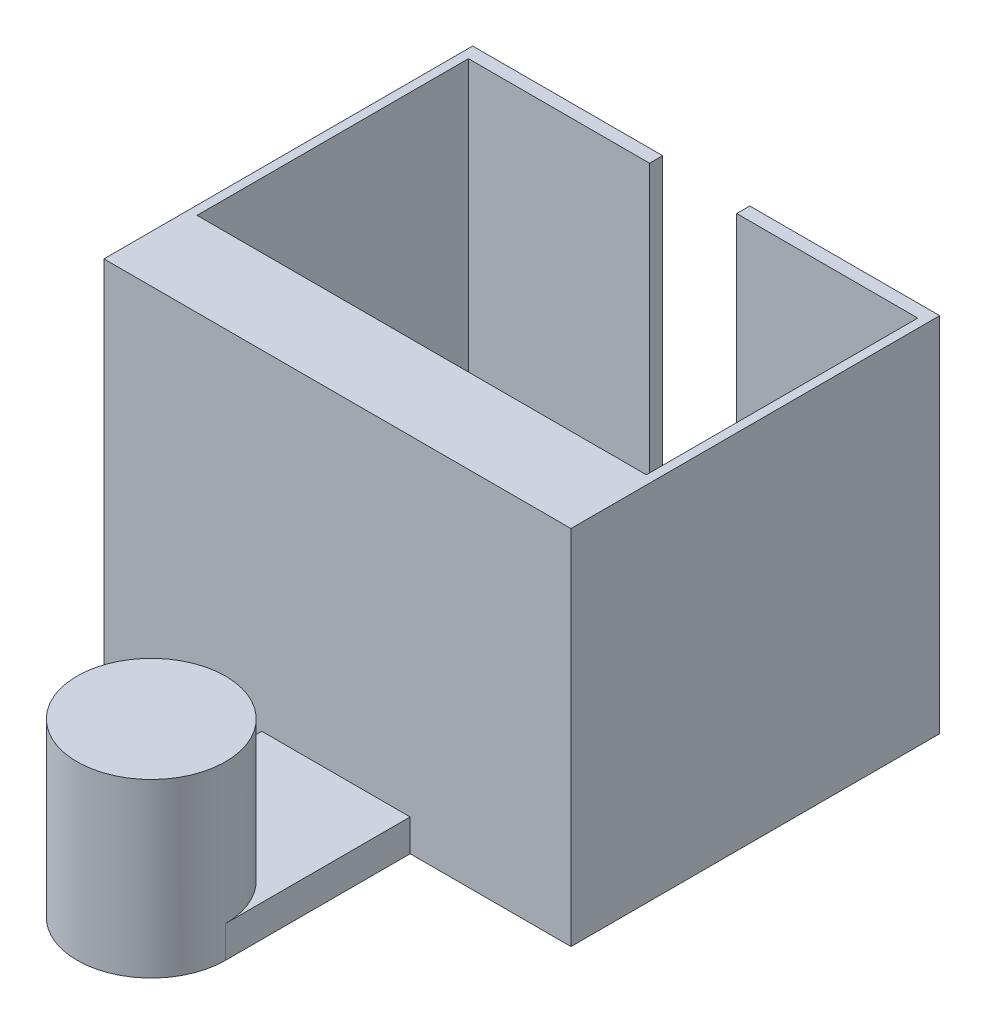
ISO-10303-21;
HEADER;
FILE_DESCRIPTION(('STEP AP214'),'2;1');
FILE_NAME('part.step','',(''),(''),'','','');
FILE_SCHEMA(('AUTOMOTIVE_DESIGN { 1 0 10303 214 1 1 1 1 }'));
ENDSEC;
DATA;
#1=APPLICATION_CONTEXT('core data for automotive mechanical design processes');
#2=APPLICATION_PROTOCOL_DEFINITION('international standard','automotive_design',2000,#1);
#3=PRODUCT_CONTEXT('',#1,'mechanical');
#4=PRODUCT('Part','Part','',(#3));
#5=PRODUCT_RELATED_PRODUCT_CATEGORY('part','',(#4));
#6=PRODUCT_DEFINITION_FORMATION('','',#4);
#7=PRODUCT_DEFINITION_CONTEXT('part definition',#1,'design');
#8=PRODUCT_DEFINITION('design','',#6,#7);
#9=PRODUCT_DEFINITION_SHAPE('','',#8);
#10=(LENGTH_UNIT() NAMED_UNIT(*) SI_UNIT(.MILLI.,.METRE.));
#11=(NAMED_UNIT(*) PLANE_ANGLE_UNIT() SI_UNIT($,.RADIAN.));
#12=(NAMED_UNIT(*) SI_UNIT($,.STERADIAN.) SOLID_ANGLE_UNIT());
#13=UNCERTAINTY_MEASURE_WITH_UNIT(LENGTH_MEASURE(1.E-05),#10,'distance_accuracy_value','');
#14=(GEOMETRIC_REPRESENTATION_CONTEXT(3) GLOBAL_UNCERTAINTY_ASSIGNED_CONTEXT((#13)) GLOBAL_UNIT_ASSIGNED_CONTEXT((#10,
#11,#12)) REPRESENTATION_CONTEXT('',''));
#15=CARTESIAN_POINT('',(0.,0.,0.));
#16=DIRECTION('',(0.,0.,1.));
#17=DIRECTION('',(1.,0.,0.));
#18=AXIS2_PLACEMENT_3D('',#15,#16,#17);
#19=CARTESIAN_POINT('',(40.0418170122298,50.8,-56.0489098309949));
#20=DIRECTION('',(0.,0.,-1.));
#21=DIRECTION('',(-1.,0.,0.));
#22=AXIS2_PLACEMENT_3D('',#19,#20,#21);
#23=PLANE('',#22);
#24=DIRECTION('',(0.,-1.,0.));
#25=VECTOR('',#24,1.);
#26=CARTESIAN_POINT('',(62.1781335033808,0.,-56.0489098309949));
#27=LINE('',#26,#25);
#28=CARTESIAN_POINT('',(62.1781335033808,4.47325669650188,-56.0489098309949));
#29=VERTEX_POINT('',#28);
#30=CARTESIAN_POINT('',(62.1781335033808,0.,-56.0489098309949));
#31=VERTEX_POINT('',#30);
#32=EDGE_CURVE('E61',#29,#31,#27,.T.);
#33=ORIENTED_EDGE('',*,*,#32,.F.);
#34=DIRECTION('',(-1.,0.,0.));
#35=VECTOR('',#34,1.);
#36=CARTESIAN_POINT('',(62.1781335033808,4.47325669650188,-56.0489098309949));
#37=LINE('',#36,#35);
#38=CARTESIAN_POINT('',(83.0107805210788,4.47325669650189,-56.0489098309949));
#39=VERTEX_POINT('',#38);
#40=EDGE_CURVE('E196',#39,#29,#37,.T.);
#41=ORIENTED_EDGE('',*,*,#40,.F.);
#42=DIRECTION('',(0.,1.,0.));
#43=VECTOR('',#42,1.);
#44=CARTESIAN_POINT('',(83.0107805210788,0.,-56.0489098309949));
#45=LINE('',#44,#43);
#46=CARTESIAN_POINT('',(83.0107805210788,0.,-56.0489098309949));
#47=VERTEX_POINT('',#46);
#48=EDGE_CURVE('E67',#47,#39,#45,.T.);
#49=ORIENTED_EDGE('',*,*,#48,.F.);
#50=DIRECTION('',(1.,0.,0.));
#51=VECTOR('',#50,1.);
#52=CARTESIAN_POINT('',(40.0418170122298,0.,-56.0489098309949));
#53=LINE('',#52,#51);
#54=CARTESIAN_POINT('',(105.57381701223,0.,-56.0489098309949));
#55=VERTEX_POINT('',#54);
#56=EDGE_CURVE('E178',#47,#55,#53,.T.);
#57=ORIENTED_EDGE('',*,*,#56,.T.);
#58=DIRECTION('',(0.,-1.,0.));
#59=VECTOR('',#58,1.);
#60=CARTESIAN_POINT('',(105.57381701223,50.8,-56.0489098309949));
#61=LINE('',#60,#59);
#62=CARTESIAN_POINT('',(105.57381701223,50.8,-56.0489098309949));
#63=VERTEX_POINT('',#62);
#64=EDGE_CURVE('E54',#63,#55,#61,.T.);
#65=ORIENTED_EDGE('',*,*,#64,.F.);
#66=DIRECTION('',(1.,0.,0.));
#67=VECTOR('',#66,1.);
#68=CARTESIAN_POINT('',(40.0418170122298,50.8,-56.0489098309949));
#69=LINE('',#68,#67);
#70=CARTESIAN_POINT('',(40.0418170122298,50.8,-56.0489098309949));
#71=VERTEX_POINT('',#70);
#72=EDGE_CURVE('E216',#71,#63,#69,.T.);
#73=ORIENTED_EDGE('',*,*,#72,.F.);
#74=DIRECTION('',(0.,-1.,0.));
#75=VECTOR('',#74,1.);
#76=CARTESIAN_POINT('',(40.0418170122298,50.8,-56.0489098309949));
#77=LINE('',#76,#75);
#78=CARTESIAN_POINT('',(40.0418170122298,0.,-56.0489098309949));
#79=VERTEX_POINT('',#78);
#80=EDGE_CURVE('E11',#71,#79,#77,.T.);
#81=ORIENTED_EDGE('',*,*,#80,.T.);
#82=EDGE_CURVE('E254',#79,#31,#53,.T.);
#83=ORIENTED_EDGE('',*,*,#82,.T.);
#84=EDGE_LOOP('',(#33,#41,#49,#57,#65,#73,#81,#83));
#85=FACE_BOUND('',#84,.T.);
#86=ADVANCED_FACE('F45',(#85),#23,.F.);
#87=CARTESIAN_POINT('',(40.0418170122298,50.8,-56.0489098309949));
#88=DIRECTION('',(1.,0.,0.));
#89=DIRECTION('',(0.,0.,-1.));
#90=AXIS2_PLACEMENT_3D('',#87,#88,#89);
#91=PLANE('',#90);
#92=DIRECTION('',(0.,0.,1.));
#93=VECTOR('',#92,1.);
#94=CARTESIAN_POINT('',(40.0418170122298,0.,-56.0489098309949));
#95=LINE('',#94,#93);
#96=CARTESIAN_POINT('',(40.0418170122298,0.,-107.786627361446));
#97=VERTEX_POINT('',#96);
#98=EDGE_CURVE('E211',#97,#79,#95,.T.);
#99=ORIENTED_EDGE('',*,*,#98,.T.);
#100=ORIENTED_EDGE('',*,*,#80,.F.);
#101=DIRECTION('',(0.,0.,1.));
#102=VECTOR('',#101,1.);
#103=CARTESIAN_POINT('',(40.0418170122298,50.8,-56.0489098309949));
#104=LINE('',#103,#102);
#105=CARTESIAN_POINT('',(40.0418170122298,50.8,-107.786627361446));
#106=VERTEX_POINT('',#105);
#107=EDGE_CURVE('E212',#106,#71,#104,.T.);
#108=ORIENTED_EDGE('',*,*,#107,.F.);
#109=DIRECTION('',(0.,-1.,0.));
#110=VECTOR('',#109,1.);
#111=CARTESIAN_POINT('',(40.0418170122298,50.8,-107.786627361446));
#112=LINE('',#111,#110);
#113=EDGE_CURVE('E250',#106,#97,#112,.T.);
#114=ORIENTED_EDGE('',*,*,#113,.T.);
#115=EDGE_LOOP('',(#99,#100,#108,#114));
#116=FACE_BOUND('',#115,.T.);
#117=ADVANCED_FACE('F47',(#116),#91,.F.);
#118=CARTESIAN_POINT('',(105.57381701223,50.8,-56.0489098309949));
#119=DIRECTION('',(-1.,0.,0.));
#120=DIRECTION('',(0.,0.,1.));
#121=AXIS2_PLACEMENT_3D('',#118,#119,#120);
#122=PLANE('',#121);
#123=DIRECTION('',(0.,0.,-1.));
#124=VECTOR('',#123,1.);
#125=CARTESIAN_POINT('',(105.57381701223,0.,-56.0489098309949));
#126=LINE('',#125,#124);
#127=CARTESIAN_POINT('',(105.57381701223,0.,-107.786627361446));
#128=VERTEX_POINT('',#127);
#129=EDGE_CURVE('E257',#55,#128,#126,.T.);
#130=ORIENTED_EDGE('',*,*,#129,.T.);
#131=DIRECTION('',(0.,-1.,0.));
#132=VECTOR('',#131,1.);
#133=CARTESIAN_POINT('',(105.57381701223,50.8,-107.786627361446));
#134=LINE('',#133,#132);
#135=CARTESIAN_POINT('',(105.57381701223,50.8,-107.786627361446));
#136=VERTEX_POINT('',#135);
#137=EDGE_CURVE('E321',#136,#128,#134,.T.);
#138=ORIENTED_EDGE('',*,*,#137,.F.);
#139=DIRECTION('',(0.,0.,-1.));
#140=VECTOR('',#139,1.);
#141=CARTESIAN_POINT('',(105.57381701223,50.8,-56.0489098309949));
#142=LINE('',#141,#140);
#143=EDGE_CURVE('E220',#63,#136,#142,.T.);
#144=ORIENTED_EDGE('',*,*,#143,.F.);
#145=ORIENTED_EDGE('',*,*,#64,.T.);
#146=EDGE_LOOP('',(#130,#138,#144,#145));
#147=FACE_BOUND('',#146,.T.);
#148=ADVANCED_FACE('F329',(#147),#122,.F.);
#149=CARTESIAN_POINT('',(78.9190570122298,50.8,-107.786627361446));
#150=DIRECTION('',(0.,0.,1.));
#151=DIRECTION('',(1.,0.,0.));
#152=AXIS2_PLACEMENT_3D('',#149,#150,#151);
#153=PLANE('',#152);
#154=DIRECTION('',(-1.,0.,0.));
#155=VECTOR('',#154,1.);
#156=CARTESIAN_POINT('',(78.9190570122298,0.,-107.786627361446));
#157=LINE('',#156,#155);
#158=CARTESIAN_POINT('',(78.9190570122298,0.,-107.786627361446));
#159=VERTEX_POINT('',#158);
#160=EDGE_CURVE('E260',#128,#159,#157,.T.);
#161=ORIENTED_EDGE('',*,*,#160,.T.);
#162=DIRECTION('',(0.,-1.,0.));
#163=VECTOR('',#162,1.);
#164=CARTESIAN_POINT('',(78.9190570122298,50.8,-107.786627361446));
#165=LINE('',#164,#163);
#166=CARTESIAN_POINT('',(78.9190570122298,50.8,-107.786627361446));
#167=VERTEX_POINT('',#166);
#168=EDGE_CURVE('E317',#167,#159,#165,.T.);
#169=ORIENTED_EDGE('',*,*,#168,.F.);
#170=DIRECTION('',(-1.,0.,0.));
#171=VECTOR('',#170,1.);
#172=CARTESIAN_POINT('',(78.9190570122298,50.8,-107.786627361446));
#173=LINE('',#172,#171);
#174=EDGE_CURVE('E223',#136,#167,#173,.T.);
#175=ORIENTED_EDGE('',*,*,#174,.F.);
#176=ORIENTED_EDGE('',*,*,#137,.T.);
#177=EDGE_LOOP('',(#161,#169,#175,#176));
#178=FACE_BOUND('',#177,.T.);
#179=ADVANCED_FACE('F336',(#178),#153,.F.);
#180=CARTESIAN_POINT('',(78.9190570122298,50.8,-105.952916401386));
#181=DIRECTION('',(1.,0.,0.));
#182=DIRECTION('',(0.,0.,-1.));
#183=AXIS2_PLACEMENT_3D('',#180,#181,#182);
#184=PLANE('',#183);
#185=DIRECTION('',(0.,0.,1.));
#186=VECTOR('',#185,1.);
#187=CARTESIAN_POINT('',(78.9190570122298,0.,-105.952916401386));
#188=LINE('',#187,#186);
#189=CARTESIAN_POINT('',(78.9190570122298,0.,-105.952916401386));
#190=VERTEX_POINT('',#189);
#191=EDGE_CURVE('E263',#159,#190,#188,.T.);
#192=ORIENTED_EDGE('',*,*,#191,.T.);
#193=DIRECTION('',(0.,-1.,0.));
#194=VECTOR('',#193,1.);
#195=CARTESIAN_POINT('',(78.9190570122298,50.8,-105.952916401386));
#196=LINE('',#195,#194);
#197=CARTESIAN_POINT('',(78.9190570122298,50.8,-105.952916401386));
#198=VERTEX_POINT('',#197);
#199=EDGE_CURVE('E313',#198,#190,#196,.T.);
#200=ORIENTED_EDGE('',*,*,#199,.F.);
#201=DIRECTION('',(0.,0.,1.));
#202=VECTOR('',#201,1.);
#203=CARTESIAN_POINT('',(78.9190570122298,50.8,-105.952916401386));
#204=LINE('',#203,#202);
#205=EDGE_CURVE('E226',#167,#198,#204,.T.);
#206=ORIENTED_EDGE('',*,*,#205,.F.);
#207=ORIENTED_EDGE('',*,*,#168,.T.);
#208=EDGE_LOOP('',(#192,#200,#206,#207));
#209=FACE_BOUND('',#208,.T.);
#210=ADVANCED_FACE('F340',(#209),#184,.F.);
#211=CARTESIAN_POINT('',(104.32921701223,50.8,-105.952916401386));
#212=DIRECTION('',(0.,0.,-1.));
#213=DIRECTION('',(-1.,0.,0.));
#214=AXIS2_PLACEMENT_3D('',#211,#212,#213);
#215=PLANE('',#214);
#216=DIRECTION('',(1.,0.,0.));
#217=VECTOR('',#216,1.);
#218=CARTESIAN_POINT('',(104.32921701223,0.,-105.952916401386));
#219=LINE('',#218,#217);
#220=CARTESIAN_POINT('',(104.32921701223,0.,-105.952916401386));
#221=VERTEX_POINT('',#220);
#222=EDGE_CURVE('E266',#190,#221,#219,.T.);
#223=ORIENTED_EDGE('',*,*,#222,.T.);
#224=DIRECTION('',(0.,-1.,0.));
#225=VECTOR('',#224,1.);
#226=CARTESIAN_POINT('',(104.32921701223,50.8,-105.952916401386));
#227=LINE('',#226,#225);
#228=CARTESIAN_POINT('',(104.32921701223,50.8,-105.952916401386));
#229=VERTEX_POINT('',#228);
#230=EDGE_CURVE('E309',#229,#221,#227,.T.);
#231=ORIENTED_EDGE('',*,*,#230,.F.);
#232=DIRECTION('',(1.,0.,0.));
#233=VECTOR('',#232,1.);
#234=CARTESIAN_POINT('',(104.32921701223,50.8,-105.952916401386));
#235=LINE('',#234,#233);
#236=EDGE_CURVE('E229',#198,#229,#235,.T.);
#237=ORIENTED_EDGE('',*,*,#236,.F.);
#238=ORIENTED_EDGE('',*,*,#199,.T.);
#239=EDGE_LOOP('',(#223,#231,#237,#238));
#240=FACE_BOUND('',#239,.T.);
#241=ADVANCED_FACE('F380',(#240),#215,.F.);
#242=CARTESIAN_POINT('',(104.32921701223,50.8,-67.8719664013859));
#243=DIRECTION('',(1.,0.,0.));
#244=DIRECTION('',(0.,0.,-1.));
#245=AXIS2_PLACEMENT_3D('',#242,#243,#244);
#246=PLANE('',#245);
#247=DIRECTION('',(0.,0.,1.));
#248=VECTOR('',#247,1.);
#249=CARTESIAN_POINT('',(104.32921701223,0.,-67.8719664013859));
#250=LINE('',#249,#248);
#251=CARTESIAN_POINT('',(104.32921701223,0.,-67.8719664013859));
#252=VERTEX_POINT('',#251);
#253=EDGE_CURVE('E269',#221,#252,#250,.T.);
#254=ORIENTED_EDGE('',*,*,#253,.T.);
#255=DIRECTION('',(0.,-1.,0.));
#256=VECTOR('',#255,1.);
#257=CARTESIAN_POINT('',(104.32921701223,50.8,-67.8719664013859));
#258=LINE('',#257,#256);
#259=CARTESIAN_POINT('',(104.32921701223,50.8,-67.8719664013859));
#260=VERTEX_POINT('',#259);
#261=EDGE_CURVE('E305',#260,#252,#258,.T.);
#262=ORIENTED_EDGE('',*,*,#261,.F.);
#263=DIRECTION('',(0.,0.,1.));
#264=VECTOR('',#263,1.);
#265=CARTESIAN_POINT('',(104.32921701223,50.8,-67.8719664013859));
#266=LINE('',#265,#264);
#267=EDGE_CURVE('E232',#229,#260,#266,.T.);
#268=ORIENTED_EDGE('',*,*,#267,.F.);
#269=ORIENTED_EDGE('',*,*,#230,.T.);
#270=EDGE_LOOP('',(#254,#262,#268,#269));
#271=FACE_BOUND('',#270,.T.);
#272=ADVANCED_FACE('F383',(#271),#246,.F.);
#273=CARTESIAN_POINT('',(41.2864170122298,50.8,-67.8719664013859));
#274=DIRECTION('',(0.,0.,1.));
#275=DIRECTION('',(1.,0.,0.));
#276=AXIS2_PLACEMENT_3D('',#273,#274,#275);
#277=PLANE('',#276);
#278=DIRECTION('',(-1.,0.,0.));
#279=VECTOR('',#278,1.);
#280=CARTESIAN_POINT('',(41.2864170122298,0.,-67.8719664013859));
#281=LINE('',#280,#279);
#282=CARTESIAN_POINT('',(41.2864170122298,0.,-67.8719664013859));
#283=VERTEX_POINT('',#282);
#284=EDGE_CURVE('E272',#252,#283,#281,.T.);
#285=ORIENTED_EDGE('',*,*,#284,.T.);
#286=DIRECTION('',(0.,-1.,0.));
#287=VECTOR('',#286,1.);
#288=CARTESIAN_POINT('',(41.2864170122298,50.8,-67.8719664013859));
#289=LINE('',#288,#287);
#290=CARTESIAN_POINT('',(41.2864170122298,50.8,-67.8719664013859));
#291=VERTEX_POINT('',#290);
#292=EDGE_CURVE('E301',#291,#283,#289,.T.);
#293=ORIENTED_EDGE('',*,*,#292,.F.);
#294=DIRECTION('',(-1.,0.,0.));
#295=VECTOR('',#294,1.);
#296=CARTESIAN_POINT('',(41.2864170122298,50.8,-67.8719664013859));
#297=LINE('',#296,#295);
#298=EDGE_CURVE('E235',#260,#291,#297,.T.);
#299=ORIENTED_EDGE('',*,*,#298,.F.);
#300=ORIENTED_EDGE('',*,*,#261,.T.);
#301=EDGE_LOOP('',(#285,#293,#299,#300));
#302=FACE_BOUND('',#301,.T.);
#303=ADVANCED_FACE('F387',(#302),#277,.F.);
#304=CARTESIAN_POINT('',(41.2864170122298,50.8,-105.952916401386));
#305=DIRECTION('',(-1.,0.,0.));
#306=DIRECTION('',(0.,0.,1.));
#307=AXIS2_PLACEMENT_3D('',#304,#305,#306);
#308=PLANE('',#307);
#309=DIRECTION('',(0.,0.,-1.));
#310=VECTOR('',#309,1.);
#311=CARTESIAN_POINT('',(41.2864170122298,0.,-105.952916401386));
#312=LINE('',#311,#310);
#313=CARTESIAN_POINT('',(41.2864170122298,0.,-105.952916401386));
#314=VERTEX_POINT('',#313);
#315=EDGE_CURVE('E275',#283,#314,#312,.T.);
#316=ORIENTED_EDGE('',*,*,#315,.T.);
#317=DIRECTION('',(0.,-1.,0.));
#318=VECTOR('',#317,1.);
#319=CARTESIAN_POINT('',(41.2864170122298,50.8,-105.952916401386));
#320=LINE('',#319,#318);
#321=CARTESIAN_POINT('',(41.2864170122298,50.8,-105.952916401386));
#322=VERTEX_POINT('',#321);
#323=EDGE_CURVE('E297',#322,#314,#320,.T.);
#324=ORIENTED_EDGE('',*,*,#323,.F.);
#325=DIRECTION('',(0.,0.,-1.));
#326=VECTOR('',#325,1.);
#327=CARTESIAN_POINT('',(41.2864170122298,50.8,-105.952916401386));
#328=LINE('',#327,#326);
#329=EDGE_CURVE('E238',#291,#322,#328,.T.);
#330=ORIENTED_EDGE('',*,*,#329,.F.);
#331=ORIENTED_EDGE('',*,*,#292,.T.);
#332=EDGE_LOOP('',(#316,#324,#330,#331));
#333=FACE_BOUND('',#332,.T.);
#334=ADVANCED_FACE('F391',(#333),#308,.F.);
#335=CARTESIAN_POINT('',(66.6965770122298,50.8,-105.952916401386));
#336=DIRECTION('',(0.,0.,-1.));
#337=DIRECTION('',(-1.,0.,0.));
#338=AXIS2_PLACEMENT_3D('',#335,#336,#337);
#339=PLANE('',#338);
#340=DIRECTION('',(1.,0.,0.));
#341=VECTOR('',#340,1.);
#342=CARTESIAN_POINT('',(66.6965770122298,0.,-105.952916401386));
#343=LINE('',#342,#341);
#344=CARTESIAN_POINT('',(66.6965770122298,0.,-105.952916401386));
#345=VERTEX_POINT('',#344);
#346=EDGE_CURVE('E278',#314,#345,#343,.T.);
#347=ORIENTED_EDGE('',*,*,#346,.T.);
#348=DIRECTION('',(0.,-1.,0.));
#349=VECTOR('',#348,1.);
#350=CARTESIAN_POINT('',(66.6965770122298,50.8,-105.952916401386));
#351=LINE('',#350,#349);
#352=CARTESIAN_POINT('',(66.6965770122298,50.8,-105.952916401386));
#353=VERTEX_POINT('',#352);
#354=EDGE_CURVE('E293',#353,#345,#351,.T.);
#355=ORIENTED_EDGE('',*,*,#354,.F.);
#356=DIRECTION('',(1.,0.,0.));
#357=VECTOR('',#356,1.);
#358=CARTESIAN_POINT('',(66.6965770122298,50.8,-105.952916401386));
#359=LINE('',#358,#357);
#360=EDGE_CURVE('E241',#322,#353,#359,.T.);
#361=ORIENTED_EDGE('',*,*,#360,.F.);
#362=ORIENTED_EDGE('',*,*,#323,.T.);
#363=EDGE_LOOP('',(#347,#355,#361,#362));
#364=FACE_BOUND('',#363,.T.);
#365=ADVANCED_FACE('F395',(#364),#339,.F.);
#366=CARTESIAN_POINT('',(66.6965770122298,50.8,-107.786627361446));
#367=DIRECTION('',(-1.,0.,0.));
#368=DIRECTION('',(0.,0.,1.));
#369=AXIS2_PLACEMENT_3D('',#366,#367,#368);
#370=PLANE('',#369);
#371=DIRECTION('',(0.,0.,-1.));
#372=VECTOR('',#371,1.);
#373=CARTESIAN_POINT('',(66.6965770122298,0.,-107.786627361446));
#374=LINE('',#373,#372);
#375=CARTESIAN_POINT('',(66.6965770122298,0.,-107.786627361446));
#376=VERTEX_POINT('',#375);
#377=EDGE_CURVE('E281',#345,#376,#374,.T.);
#378=ORIENTED_EDGE('',*,*,#377,.T.);
#379=DIRECTION('',(0.,-1.,0.));
#380=VECTOR('',#379,1.);
#381=CARTESIAN_POINT('',(66.6965770122298,50.8,-107.786627361446));
#382=LINE('',#381,#380);
#383=CARTESIAN_POINT('',(66.6965770122298,50.8,-107.786627361446));
#384=VERTEX_POINT('',#383);
#385=EDGE_CURVE('E289',#384,#376,#382,.T.);
#386=ORIENTED_EDGE('',*,*,#385,.F.);
#387=DIRECTION('',(0.,0.,-1.));
#388=VECTOR('',#387,1.);
#389=CARTESIAN_POINT('',(66.6965770122298,50.8,-107.786627361446));
#390=LINE('',#389,#388);
#391=EDGE_CURVE('E244',#353,#384,#390,.T.);
#392=ORIENTED_EDGE('',*,*,#391,.F.);
#393=ORIENTED_EDGE('',*,*,#354,.T.);
#394=EDGE_LOOP('',(#378,#386,#392,#393));
#395=FACE_BOUND('',#394,.T.);
#396=ADVANCED_FACE('F399',(#395),#370,.F.);
#397=CARTESIAN_POINT('',(40.0418170122298,50.8,-107.786627361446));
#398=DIRECTION('',(0.,0.,1.));
#399=DIRECTION('',(1.,0.,0.));
#400=AXIS2_PLACEMENT_3D('',#397,#398,#399);
#401=PLANE('',#400);
#402=DIRECTION('',(-1.,0.,0.));
#403=VECTOR('',#402,1.);
#404=CARTESIAN_POINT('',(40.0418170122298,0.,-107.786627361446));
#405=LINE('',#404,#403);
#406=EDGE_CURVE('E217',#376,#97,#405,.T.);
#407=ORIENTED_EDGE('',*,*,#406,.T.);
#408=ORIENTED_EDGE('',*,*,#113,.F.);
#409=DIRECTION('',(-1.,0.,0.));
#410=VECTOR('',#409,1.);
#411=CARTESIAN_POINT('',(40.0418170122298,50.8,-107.786627361446));
#412=LINE('',#411,#410);
#413=EDGE_CURVE('E247',#384,#106,#412,.T.);
#414=ORIENTED_EDGE('',*,*,#413,.F.);
#415=ORIENTED_EDGE('',*,*,#385,.T.);
#416=EDGE_LOOP('',(#407,#408,#414,#415));
#417=FACE_BOUND('',#416,.T.);
#418=ADVANCED_FACE('F403',(#417),#401,.F.);
#419=CARTESIAN_POINT('',(0.,50.8,0.));
#420=DIRECTION('',(0.,-1.,0.));
#421=DIRECTION('',(0.,0.,-1.));
#422=AXIS2_PLACEMENT_3D('',#419,#420,#421);
#423=PLANE('',#422);
#424=ORIENTED_EDGE('',*,*,#107,.T.);
#425=ORIENTED_EDGE('',*,*,#72,.T.);
#426=ORIENTED_EDGE('',*,*,#143,.T.);
#427=ORIENTED_EDGE('',*,*,#174,.T.);
#428=ORIENTED_EDGE('',*,*,#205,.T.);
#429=ORIENTED_EDGE('',*,*,#236,.T.);
#430=ORIENTED_EDGE('',*,*,#267,.T.);
#431=ORIENTED_EDGE('',*,*,#298,.T.);
#432=ORIENTED_EDGE('',*,*,#329,.T.);
#433=ORIENTED_EDGE('',*,*,#360,.T.);
#434=ORIENTED_EDGE('',*,*,#391,.T.);
#435=ORIENTED_EDGE('',*,*,#413,.T.);
#436=EDGE_LOOP('',(#424,#425,#426,#427,#428,#429,#430,#431,#432,#433,#434,#435));
#437=FACE_BOUND('',#436,.T.);
#438=ADVANCED_FACE('F344',(#437),#423,.F.);
#439=CARTESIAN_POINT('',(0.,0.,0.));
#440=DIRECTION('',(0.,-1.,0.));
#441=DIRECTION('',(0.,0.,-1.));
#442=AXIS2_PLACEMENT_3D('',#439,#440,#441);
#443=PLANE('',#442);
#444=DIRECTION('',(0.,0.,-1.));
#445=VECTOR('',#444,1.);
#446=CARTESIAN_POINT('',(83.0107805210788,0.,-30.1409098309949));
#447=LINE('',#446,#445);
#448=CARTESIAN_POINT('',(83.0107805210788,0.,-30.1409098309949));
#449=VERTEX_POINT('',#448);
#450=EDGE_CURVE('E162',#449,#47,#447,.T.);
#451=ORIENTED_EDGE('',*,*,#450,.F.);
#452=CARTESIAN_POINT('',(72.5944570122298,0.,-30.1409098309949));
#453=DIRECTION('',(0.,-1.,0.));
#454=DIRECTION('',(0.,0.,-1.));
#455=AXIS2_PLACEMENT_3D('',#452,#453,#454);
#456=CIRCLE('',#455,10.416323508849);
#457=CARTESIAN_POINT('',(62.1781335033808,0.,-30.1409098309949));
#458=VERTEX_POINT('',#457);
#459=EDGE_CURVE('E176',#449,#458,#456,.T.);
#460=ORIENTED_EDGE('',*,*,#459,.T.);
#461=DIRECTION('',(0.,0.,-1.));
#462=VECTOR('',#461,1.);
#463=CARTESIAN_POINT('',(62.1781335033808,0.,-30.1409098309949));
#464=LINE('',#463,#462);
#465=EDGE_CURVE('E180',#458,#31,#464,.T.);
#466=ORIENTED_EDGE('',*,*,#465,.T.);
#467=ORIENTED_EDGE('',*,*,#82,.F.);
#468=ORIENTED_EDGE('',*,*,#98,.F.);
#469=ORIENTED_EDGE('',*,*,#406,.F.);
#470=ORIENTED_EDGE('',*,*,#377,.F.);
#471=ORIENTED_EDGE('',*,*,#346,.F.);
#472=ORIENTED_EDGE('',*,*,#315,.F.);
#473=ORIENTED_EDGE('',*,*,#284,.F.);
#474=ORIENTED_EDGE('',*,*,#253,.F.);
#475=ORIENTED_EDGE('',*,*,#222,.F.);
#476=ORIENTED_EDGE('',*,*,#191,.F.);
#477=ORIENTED_EDGE('',*,*,#160,.F.);
#478=ORIENTED_EDGE('',*,*,#129,.F.);
#479=ORIENTED_EDGE('',*,*,#56,.F.);
#480=EDGE_LOOP('',(#451,#460,#466,#467,#468,#469,#470,#471,#472,#473,#474,#475,#476,#477,#478,#479));
#481=FACE_BOUND('',#480,.T.);
#482=ADVANCED_FACE('F174',(#481),#443,.T.);
#483=CARTESIAN_POINT('',(62.1781335033808,0.,-30.1409098309949));
#484=DIRECTION('',(1.,0.,0.));
#485=DIRECTION('',(0.,0.,-1.));
#486=AXIS2_PLACEMENT_3D('',#483,#484,#485);
#487=PLANE('',#486);
#488=ORIENTED_EDGE('',*,*,#32,.T.);
#489=ORIENTED_EDGE('',*,*,#465,.F.);
#490=DIRECTION('',(0.,-1.,0.));
#491=VECTOR('',#490,1.);
#492=CARTESIAN_POINT('',(62.1781335033808,0.,-30.1409098309949));
#493=LINE('',#492,#491);
#494=CARTESIAN_POINT('',(62.1781335033808,4.47325669650188,-30.1409098309949));
#495=VERTEX_POINT('',#494);
#496=EDGE_CURVE('E170',#495,#458,#493,.T.);
#497=ORIENTED_EDGE('',*,*,#496,.F.);
#498=DIRECTION('',(0.,0.,-1.));
#499=VECTOR('',#498,1.);
#500=CARTESIAN_POINT('',(62.1781335033808,4.47325669650188,-30.1409098309949));
#501=LINE('',#500,#499);
#502=EDGE_CURVE('E169',#495,#29,#501,.T.);
#503=ORIENTED_EDGE('',*,*,#502,.T.);
#504=EDGE_LOOP('',(#488,#489,#497,#503));
#505=FACE_BOUND('',#504,.T.);
#506=ADVANCED_FACE('F354',(#505),#487,.F.);
#507=CARTESIAN_POINT('',(83.0107805210788,0.,-30.1409098309949));
#508=DIRECTION('',(-1.,0.,0.));
#509=DIRECTION('',(0.,0.,1.));
#510=AXIS2_PLACEMENT_3D('',#507,#508,#509);
#511=PLANE('',#510);
#512=ORIENTED_EDGE('',*,*,#48,.T.);
#513=DIRECTION('',(0.,0.,-1.));
#514=VECTOR('',#513,1.);
#515=CARTESIAN_POINT('',(83.0107805210788,4.47325669650189,-30.1409098309949));
#516=LINE('',#515,#514);
#517=CARTESIAN_POINT('',(83.0107805210788,4.47325669650189,-30.1409098309949));
#518=VERTEX_POINT('',#517);
#519=EDGE_CURVE('E164',#518,#39,#516,.T.);
#520=ORIENTED_EDGE('',*,*,#519,.F.);
#521=DIRECTION('',(0.,1.,0.));
#522=VECTOR('',#521,1.);
#523=CARTESIAN_POINT('',(83.0107805210788,0.,-30.1409098309949));
#524=LINE('',#523,#522);
#525=EDGE_CURVE('E159',#449,#518,#524,.T.);
#526=ORIENTED_EDGE('',*,*,#525,.F.);
#527=ORIENTED_EDGE('',*,*,#450,.T.);
#528=EDGE_LOOP('',(#512,#520,#526,#527));
#529=FACE_BOUND('',#528,.T.);
#530=ADVANCED_FACE('F161',(#529),#511,.F.);
#531=CARTESIAN_POINT('',(62.1781335033808,4.47325669650188,-30.1409098309949));
#532=DIRECTION('',(0.,-1.,0.));
#533=DIRECTION('',(1.,0.,0.));
#534=AXIS2_PLACEMENT_3D('',#531,#532,#533);
#535=PLANE('',#534);
#536=ORIENTED_EDGE('',*,*,#502,.F.);
#537=CARTESIAN_POINT('',(72.5944570122298,4.47325669650189,-30.1409098309949));
#538=DIRECTION('',(0.,-1.,0.));
#539=DIRECTION('',(1.,0.,0.));
#540=AXIS2_PLACEMENT_3D('',#537,#538,#539);
#541=CIRCLE('',#540,10.416323508849);
#542=EDGE_CURVE('E190',#495,#518,#541,.T.);
#543=ORIENTED_EDGE('',*,*,#542,.T.);
#544=ORIENTED_EDGE('',*,*,#519,.T.);
#545=ORIENTED_EDGE('',*,*,#40,.T.);
#546=EDGE_LOOP('',(#536,#543,#544,#545));
#547=FACE_BOUND('',#546,.T.);
#548=ADVANCED_FACE('F356',(#547),#535,.F.);
#549=CARTESIAN_POINT('',(72.5944570122298,24.13,-30.1409098309949));
#550=DIRECTION('',(0.,-1.,0.));
#551=DIRECTION('',(0.,0.,-1.));
#552=AXIS2_PLACEMENT_3D('',#549,#550,#551);
#553=CYLINDRICAL_SURFACE('',#552,10.416323508849);
#554=CARTESIAN_POINT('',(72.5944570122298,24.13,-30.1409098309949));
#555=DIRECTION('',(0.,-1.,0.));
#556=DIRECTION('',(0.,0.,-1.));
#557=AXIS2_PLACEMENT_3D('',#554,#555,#556);
#558=CIRCLE('',#557,10.416323508849);
#559=CARTESIAN_POINT('',(72.5944570122298,24.13,-40.5572333398439));
#560=VERTEX_POINT('',#559);
#561=EDGE_CURVE('E186',#560,#560,#558,.T.);
#562=ORIENTED_EDGE('',*,*,#561,.T.);
#563=EDGE_LOOP('',(#562));
#564=FACE_BOUND('',#563,.T.);
#565=ORIENTED_EDGE('',*,*,#525,.T.);
#566=ORIENTED_EDGE('',*,*,#542,.F.);
#567=ORIENTED_EDGE('',*,*,#496,.T.);
#568=ORIENTED_EDGE('',*,*,#459,.F.);
#569=EDGE_LOOP('',(#565,#566,#567,#568));
#570=FACE_BOUND('',#569,.T.);
#571=ADVANCED_FACE('F183',(#564,#570),#553,.T.);
#572=CARTESIAN_POINT('',(72.5944570122298,24.13,-30.1409098309949));
#573=DIRECTION('',(0.,-1.,0.));
#574=DIRECTION('',(0.,0.,-1.));
#575=AXIS2_PLACEMENT_3D('',#572,#573,#574);
#576=PLANE('',#575);
#577=ORIENTED_EDGE('',*,*,#561,.F.);
#578=EDGE_LOOP('',(#577));
#579=FACE_BOUND('',#578,.T.);
#580=ADVANCED_FACE('F363',(#579),#576,.F.);
#581=CLOSED_SHELL('',(#86,#117,#148,#179,#210,#241,#272,#303,#334,#365,#396,#418,#438,#482,#506,
#530,#548,#571,#580));
#582=MANIFOLD_SOLID_BREP('B2',#581);
#583=ADVANCED_BREP_SHAPE_REPRESENTATION('',(#18,#582),#14);
#584=SHAPE_DEFINITION_REPRESENTATION(#9,#583);
ENDSEC;
END-ISO-10303-21;
